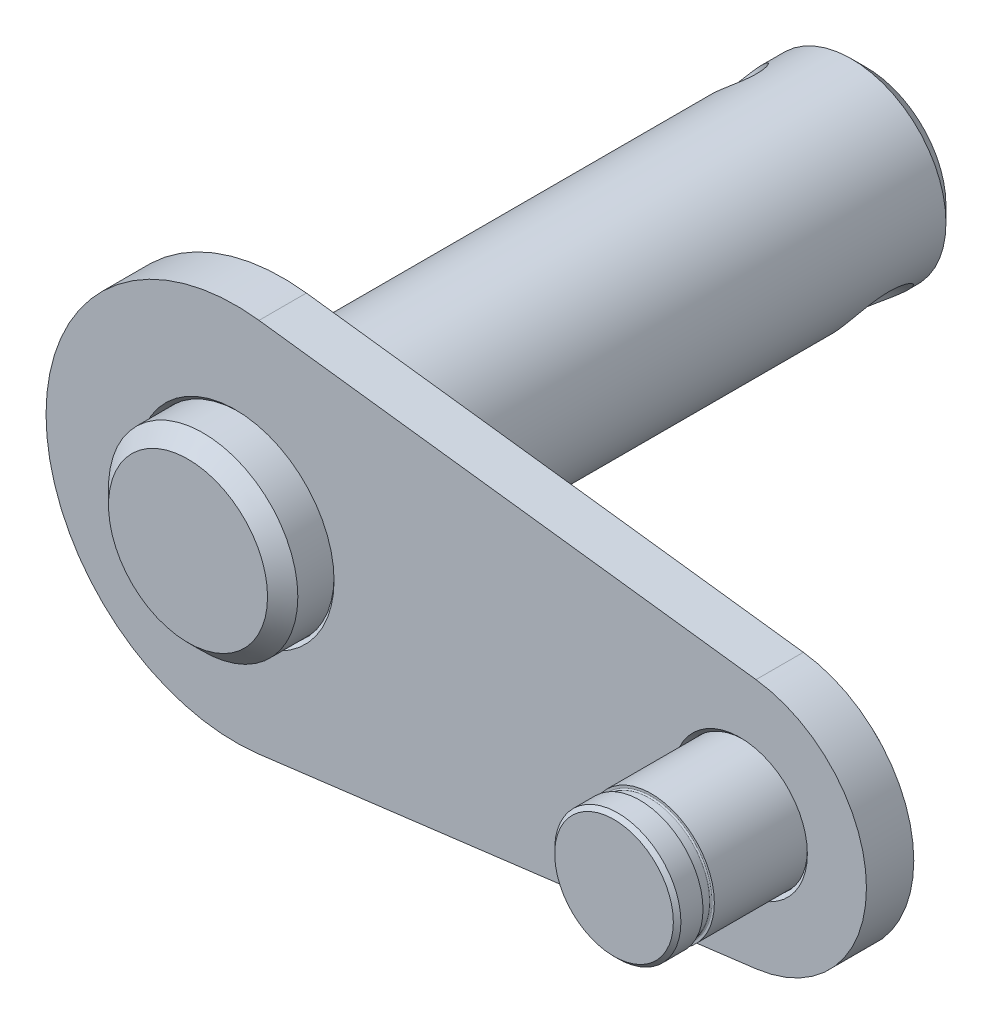
ISO-10303-21;
HEADER;
FILE_DESCRIPTION(('STEP AP214'),'2;1');
FILE_NAME('part.step','',(''),(''),'','','');
FILE_SCHEMA(('AUTOMOTIVE_DESIGN { 1 0 10303 214 1 1 1 1 }'));
ENDSEC;
DATA;
#1=APPLICATION_CONTEXT('core data for automotive mechanical design processes');
#2=APPLICATION_PROTOCOL_DEFINITION('international standard','automotive_design',2000,#1);
#3=PRODUCT_CONTEXT('',#1,'mechanical');
#4=PRODUCT('Part','Part','',(#3));
#5=PRODUCT_RELATED_PRODUCT_CATEGORY('part','',(#4));
#6=PRODUCT_DEFINITION_FORMATION('','',#4);
#7=PRODUCT_DEFINITION_CONTEXT('part definition',#1,'design');
#8=PRODUCT_DEFINITION('design','',#6,#7);
#9=PRODUCT_DEFINITION_SHAPE('','',#8);
#10=(LENGTH_UNIT() NAMED_UNIT(*) SI_UNIT(.MILLI.,.METRE.));
#11=(NAMED_UNIT(*) PLANE_ANGLE_UNIT() SI_UNIT($,.RADIAN.));
#12=(NAMED_UNIT(*) SI_UNIT($,.STERADIAN.) SOLID_ANGLE_UNIT());
#13=UNCERTAINTY_MEASURE_WITH_UNIT(LENGTH_MEASURE(1.E-05),#10,'distance_accuracy_value','');
#14=(GEOMETRIC_REPRESENTATION_CONTEXT(3) GLOBAL_UNCERTAINTY_ASSIGNED_CONTEXT((#13)) GLOBAL_UNIT_ASSIGNED_CONTEXT((#10,
#11,#12)) REPRESENTATION_CONTEXT('',''));
#15=CARTESIAN_POINT('',(0.,0.,0.));
#16=DIRECTION('',(0.,0.,1.));
#17=DIRECTION('',(1.,0.,0.));
#18=AXIS2_PLACEMENT_3D('',#15,#16,#17);
#19=CARTESIAN_POINT('',(50.8000000000001,0.,-29.8667622421394));
#20=DIRECTION('',(0.,0.,1.00000000000001));
#21=DIRECTION('',(1.,0.,0.));
#22=AXIS2_PLACEMENT_3D('',#19,#20,#21);
#23=CYLINDRICAL_SURFACE('',#22,6.35);
#24=CARTESIAN_POINT('',(50.8000000000001,0.,14.700249999999));
#25=DIRECTION('',(0.,0.,1.00000000000001));
#26=DIRECTION('',(1.,0.,0.));
#27=AXIS2_PLACEMENT_3D('',#24,#25,#26);
#28=CIRCLE('',#27,6.35);
#29=CARTESIAN_POINT('',(57.1500000000001,0.,14.700249999999));
#30=VERTEX_POINT('',#29);
#31=EDGE_CURVE('E52',#30,#30,#28,.F.);
#32=ORIENTED_EDGE('',*,*,#31,.T.);
#33=EDGE_LOOP('',(#32));
#34=FACE_BOUND('',#33,.T.);
#35=CARTESIAN_POINT('',(50.8000000000001,-3.33066907387547E-13,12.477749999999));
#36=DIRECTION('',(0.,0.,1.00000000000001));
#37=DIRECTION('',(0.,-1.,0.));
#38=AXIS2_PLACEMENT_3D('',#35,#36,#37);
#39=CIRCLE('',#38,6.35000000000001);
#40=CARTESIAN_POINT('',(50.8000000000001,-6.35000000000035,12.477749999999));
#41=VERTEX_POINT('',#40);
#42=EDGE_CURVE('E65',#41,#41,#39,.T.);
#43=ORIENTED_EDGE('',*,*,#42,.T.);
#44=EDGE_LOOP('',(#43));
#45=FACE_BOUND('',#44,.T.);
#46=ADVANCED_FACE('F45',(#34,#45),#23,.T.);
#47=CARTESIAN_POINT('',(0.,0.,15.08125));
#48=DIRECTION('',(0.,0.,1.00000000000001));
#49=DIRECTION('',(1.,0.,0.));
#50=AXIS2_PLACEMENT_3D('',#47,#48,#49);
#51=PLANE('',#50);
#52=CARTESIAN_POINT('',(50.8000000000001,0.,15.0812499999989));
#53=DIRECTION('',(0.,0.,1.00000000000001));
#54=DIRECTION('',(1.,0.,0.));
#55=AXIS2_PLACEMENT_3D('',#52,#53,#54);
#56=CIRCLE('',#55,5.969);
#57=CARTESIAN_POINT('',(56.7690000000001,0.,15.0812499999989));
#58=VERTEX_POINT('',#57);
#59=EDGE_CURVE('E60',#58,#58,#56,.T.);
#60=ORIENTED_EDGE('',*,*,#59,.T.);
#61=EDGE_LOOP('',(#60));
#62=FACE_BOUND('',#61,.T.);
#63=ADVANCED_FACE('F98',(#62),#51,.T.);
#64=CARTESIAN_POINT('',(50.8000000000001,0.,15.0812499999989));
#65=DIRECTION('',(0.,0.,-1.00000000000001));
#66=DIRECTION('',(-1.,0.,0.));
#67=AXIS2_PLACEMENT_3D('',#64,#65,#66);
#68=CONICAL_SURFACE('',#67,5.969,0.785398163397458);
#69=ORIENTED_EDGE('',*,*,#31,.F.);
#70=EDGE_LOOP('',(#69));
#71=FACE_BOUND('',#70,.T.);
#72=ORIENTED_EDGE('',*,*,#59,.F.);
#73=EDGE_LOOP('',(#72));
#74=FACE_BOUND('',#73,.T.);
#75=ADVANCED_FACE('F102',(#71,#74),#68,.T.);
#76=CARTESIAN_POINT('',(57.147235318125,-0.187360124756952,12.4777499999994));
#77=DIRECTION('',(0.,0.,-1.00000000000001));
#78=DIRECTION('',(0.,1.,0.));
#79=AXIS2_PLACEMENT_3D('',#76,#77,#78);
#80=PLANE('',#79);
#81=CARTESIAN_POINT('',(50.8000000000001,-3.33066907387547E-13,12.477749999999));
#82=DIRECTION('',(0.,0.,1.00000000000001));
#83=DIRECTION('',(0.,-1.,0.));
#84=AXIS2_PLACEMENT_3D('',#81,#82,#83);
#85=CIRCLE('',#84,6.12140000000001);
#86=CARTESIAN_POINT('',(50.8000000000001,-6.12140000000034,12.477749999999));
#87=VERTEX_POINT('',#86);
#88=EDGE_CURVE('E68',#87,#87,#85,.T.);
#89=ORIENTED_EDGE('',*,*,#88,.T.);
#90=EDGE_LOOP('',(#89));
#91=FACE_BOUND('',#90,.T.);
#92=ORIENTED_EDGE('',*,*,#42,.F.);
#93=EDGE_LOOP('',(#92));
#94=FACE_BOUND('',#93,.T.);
#95=ADVANCED_FACE('F108',(#91,#94),#80,.T.);
#96=CARTESIAN_POINT('',(50.8000000000001,-3.33066907387547E-13,12.350749999999));
#97=DIRECTION('',(0.,0.,1.00000000000001));
#98=DIRECTION('',(0.,-1.,0.));
#99=AXIS2_PLACEMENT_3D('',#96,#97,#98);
#100=TOROIDAL_SURFACE('',#99,6.12140000000001,0.127000000000005);
#101=CARTESIAN_POINT('',(50.8000000000001,-3.33066907387547E-13,12.350749999999));
#102=DIRECTION('',(0.,0.,1.00000000000001));
#103=DIRECTION('',(0.,-1.,0.));
#104=AXIS2_PLACEMENT_3D('',#101,#102,#103);
#105=CIRCLE('',#104,5.99440000000001);
#106=CARTESIAN_POINT('',(50.8000000000001,-5.99440000000034,12.350749999999));
#107=VERTEX_POINT('',#106);
#108=EDGE_CURVE('E71',#107,#107,#105,.T.);
#109=ORIENTED_EDGE('',*,*,#108,.T.);
#110=EDGE_LOOP('',(#109));
#111=FACE_BOUND('',#110,.T.);
#112=ORIENTED_EDGE('',*,*,#88,.F.);
#113=EDGE_LOOP('',(#112));
#114=FACE_BOUND('',#113,.T.);
#115=ADVANCED_FACE('F110',(#111,#114),#100,.F.);
#116=CARTESIAN_POINT('',(50.7999999999999,4.44089209850063E-13,-19.2562427449352));
#117=DIRECTION('',(0.,0.,1.00000000000001));
#118=DIRECTION('',(0.,-1.,0.));
#119=AXIS2_PLACEMENT_3D('',#116,#117,#118);
#120=CYLINDRICAL_SURFACE('',#119,5.99440000000001);
#121=CARTESIAN_POINT('',(50.8000000000001,-3.33066907387547E-13,11.4617499999989));
#122=DIRECTION('',(0.,0.,1.00000000000001));
#123=DIRECTION('',(0.,-1.,0.));
#124=AXIS2_PLACEMENT_3D('',#121,#122,#123);
#125=CIRCLE('',#124,5.99440000000001);
#126=CARTESIAN_POINT('',(50.8000000000001,-5.99440000000034,11.4617499999989));
#127=VERTEX_POINT('',#126);
#128=EDGE_CURVE('E74',#127,#127,#125,.T.);
#129=ORIENTED_EDGE('',*,*,#128,.T.);
#130=EDGE_LOOP('',(#129));
#131=FACE_BOUND('',#130,.T.);
#132=ORIENTED_EDGE('',*,*,#108,.F.);
#133=EDGE_LOOP('',(#132));
#134=FACE_BOUND('',#133,.T.);
#135=ADVANCED_FACE('F117',(#131,#134),#120,.T.);
#136=CARTESIAN_POINT('',(50.8000000000001,-3.33066907387547E-13,11.4617499999989));
#137=DIRECTION('',(0.,0.,1.00000000000001));
#138=DIRECTION('',(0.,-1.,0.));
#139=AXIS2_PLACEMENT_3D('',#136,#137,#138);
#140=TOROIDAL_SURFACE('',#139,6.12140000000001,0.127000000000003);
#141=CARTESIAN_POINT('',(50.8000000000001,-1.11022302462516E-13,11.3347499999989));
#142=DIRECTION('',(0.,0.,1.00000000000001));
#143=DIRECTION('',(0.,-1.,0.));
#144=AXIS2_PLACEMENT_3D('',#141,#142,#143);
#145=CIRCLE('',#144,6.12140000000001);
#146=CARTESIAN_POINT('',(50.8000000000001,-6.12140000000012,11.3347499999989));
#147=VERTEX_POINT('',#146);
#148=EDGE_CURVE('E77',#147,#147,#145,.T.);
#149=ORIENTED_EDGE('',*,*,#148,.T.);
#150=EDGE_LOOP('',(#149));
#151=FACE_BOUND('',#150,.T.);
#152=ORIENTED_EDGE('',*,*,#128,.F.);
#153=EDGE_LOOP('',(#152));
#154=FACE_BOUND('',#153,.T.);
#155=ADVANCED_FACE('F126',(#151,#154),#140,.F.);
#156=CARTESIAN_POINT('',(56.9187348466724,-0.180615160265796,11.3347499999994));
#157=DIRECTION('',(0.,0.,1.00000000000001));
#158=DIRECTION('',(0.,-1.,0.));
#159=AXIS2_PLACEMENT_3D('',#156,#157,#158);
#160=PLANE('',#159);
#161=CARTESIAN_POINT('',(50.8000000000001,-1.11022302462516E-13,11.3347499999989));
#162=DIRECTION('',(0.,0.,1.00000000000001));
#163=DIRECTION('',(0.,-1.,0.));
#164=AXIS2_PLACEMENT_3D('',#161,#162,#163);
#165=CIRCLE('',#164,6.35000000000001);
#166=CARTESIAN_POINT('',(50.8000000000001,-6.35000000000012,11.3347499999989));
#167=VERTEX_POINT('',#166);
#168=EDGE_CURVE('E80',#167,#167,#165,.T.);
#169=ORIENTED_EDGE('',*,*,#168,.T.);
#170=EDGE_LOOP('',(#169));
#171=FACE_BOUND('',#170,.T.);
#172=ORIENTED_EDGE('',*,*,#148,.F.);
#173=EDGE_LOOP('',(#172));
#174=FACE_BOUND('',#173,.T.);
#175=ADVANCED_FACE('F84',(#171,#174),#160,.T.);
#176=CARTESIAN_POINT('',(0.,0.,-7.14375));
#177=DIRECTION('',(0.,0.,1.00000000000001));
#178=DIRECTION('',(1.,0.,0.));
#179=AXIS2_PLACEMENT_3D('',#176,#177,#178);
#180=PLANE('',#179);
#181=CARTESIAN_POINT('',(50.8000000000003,-1.11022302462516E-13,-7.14375000000111));
#182=DIRECTION('',(0.,0.,1.00000000000001));
#183=DIRECTION('',(1.,0.,0.));
#184=AXIS2_PLACEMENT_3D('',#181,#182,#183);
#185=CIRCLE('',#184,5.969);
#186=CARTESIAN_POINT('',(56.7690000000003,-1.11022302462516E-13,-7.14375000000111));
#187=VERTEX_POINT('',#186);
#188=EDGE_CURVE('E11',#187,#187,#185,.F.);
#189=ORIENTED_EDGE('',*,*,#188,.T.);
#190=EDGE_LOOP('',(#189));
#191=FACE_BOUND('',#190,.T.);
#192=ADVANCED_FACE('F94',(#191),#180,.F.);
#193=CARTESIAN_POINT('',(50.8000000000003,-1.11022302462516E-13,-7.14375000000111));
#194=DIRECTION('',(0.,0.,1.00000000000001));
#195=DIRECTION('',(1.,0.,0.));
#196=AXIS2_PLACEMENT_3D('',#193,#194,#195);
#197=CONICAL_SURFACE('',#196,5.969,0.785398163397454);
#198=CARTESIAN_POINT('',(50.8000000000003,-1.11022302462516E-13,-6.76275000000104));
#199=DIRECTION('',(0.,0.,1.00000000000001));
#200=DIRECTION('',(1.,0.,0.));
#201=AXIS2_PLACEMENT_3D('',#198,#199,#200);
#202=CIRCLE('',#201,6.35);
#203=CARTESIAN_POINT('',(57.1500000000003,-1.11022302462516E-13,-6.76275000000104));
#204=VERTEX_POINT('',#203);
#205=EDGE_CURVE('E56',#204,#204,#202,.T.);
#206=ORIENTED_EDGE('',*,*,#205,.F.);
#207=EDGE_LOOP('',(#206));
#208=FACE_BOUND('',#207,.T.);
#209=ORIENTED_EDGE('',*,*,#188,.F.);
#210=EDGE_LOOP('',(#209));
#211=FACE_BOUND('',#210,.T.);
#212=ADVANCED_FACE('F47',(#208,#211),#197,.T.);
#213=ORIENTED_EDGE('',*,*,#205,.T.);
#214=EDGE_LOOP('',(#213));
#215=FACE_BOUND('',#214,.T.);
#216=ORIENTED_EDGE('',*,*,#168,.F.);
#217=EDGE_LOOP('',(#216));
#218=FACE_BOUND('',#217,.T.);
#219=ADVANCED_FACE('F87',(#215,#218),#23,.T.);
#220=CLOSED_SHELL('',(#46,#63,#75,#95,#115,#135,#155,#175,#192,#212,#219));
#221=MANIFOLD_SOLID_BREP('B2',#220);
#222=CARTESIAN_POINT('',(0.,1.38777878078145E-13,-61.11875));
#223=DIRECTION('',(0.,0.,1.00000000000001));
#224=DIRECTION('',(1.,0.,0.));
#225=AXIS2_PLACEMENT_3D('',#222,#223,#224);
#226=CYLINDRICAL_SURFACE('',#225,9.525);
#227=CARTESIAN_POINT('',(-4.68377995589911,8.29384291656846,-54.76875));
#228=CARTESIAN_POINT('',(-4.68378402003064,8.29384226204901,-54.909345049931));
#229=CARTESIAN_POINT('',(-4.69433092833028,8.28791137250007,-55.0499752980467));
#230=CARTESIAN_POINT('',(-4.73596023682551,8.2641914703885,-55.327172480009));
#231=CARTESIAN_POINT('',(-4.76705280516134,8.2463965862421,-55.4637373668992));
#232=CARTESIAN_POINT('',(-4.84810524928736,8.19900507017028,-55.7287536794259));
#233=CARTESIAN_POINT('',(-4.89803841293963,8.16942514373694,-55.8572162928709));
#234=CARTESIAN_POINT('',(-5.01442231957214,8.09850718420594,-56.1029061624815));
#235=CARTESIAN_POINT('',(-5.08087439275829,8.05716820415704,-56.2201325127789));
#236=CARTESIAN_POINT('',(-5.22916284416905,7.96174671624622,-56.4429837449493));
#237=CARTESIAN_POINT('',(-5.31131575571435,7.90739486819168,-56.5482827413133));
#238=CARTESIAN_POINT('',(-5.48666869963026,7.7867451752006,-56.7414085370429));
#239=CARTESIAN_POINT('',(-5.57986988539915,7.72044608264016,-56.8292335096181));
#240=CARTESIAN_POINT('',(-5.77540291076642,7.57531420515426,-56.9862792821029));
#241=CARTESIAN_POINT('',(-5.87785816720826,7.49629584197274,-57.0551757861168));
#242=CARTESIAN_POINT('',(-6.08674529361907,7.32769700879379,-57.1702934247073));
#243=CARTESIAN_POINT('',(-6.19317648273363,7.23811834157207,-57.2165184226602));
#244=CARTESIAN_POINT('',(-6.40371171719545,7.05247012550787,-57.2839252836124));
#245=CARTESIAN_POINT('',(-6.50781265926609,6.95659859310025,-57.3056615737036));
#246=CARTESIAN_POINT('',(-6.71272108730565,6.75908540225948,-57.3252186671598));
#247=CARTESIAN_POINT('',(-6.81352912693017,6.65744472177772,-57.3230435118761));
#248=CARTESIAN_POINT('',(-7.00636701285387,6.45411440924462,-57.2952291968276));
#249=CARTESIAN_POINT('',(-7.09855504700041,6.35249196551038,-57.27018909927));
#250=CARTESIAN_POINT('',(-7.27478023911175,6.14989711644213,-57.1983239113648));
#251=CARTESIAN_POINT('',(-7.35881692964114,6.04892474869609,-57.1514975725855));
#252=CARTESIAN_POINT('',(-7.51797685241814,5.84996211928975,-57.0369320495759));
#253=CARTESIAN_POINT('',(-7.59300246018938,5.75201181663803,-56.9689882569542));
#254=CARTESIAN_POINT('',(-7.73217673918558,5.56352540074797,-56.8142737184009));
#255=CARTESIAN_POINT('',(-7.79632326749839,5.47299075002301,-56.727499270947));
#256=CARTESIAN_POINT('',(-7.91501900209192,5.29994920592269,-56.5344092525627));
#257=CARTESIAN_POINT('',(-7.96920905479226,5.21777816856796,-56.4275713056199));
#258=CARTESIAN_POINT('',(-8.06519820818001,5.06814832018989,-56.1990375552524));
#259=CARTESIAN_POINT('',(-8.10699653766444,5.00069042491284,-56.0773408277517));
#260=CARTESIAN_POINT('',(-8.17832523636502,4.88317497186654,-55.821469829642));
#261=CARTESIAN_POINT('',(-8.2077768835281,4.83322939258566,-55.6872219732239));
#262=CARTESIAN_POINT('',(-8.25397579862006,4.75390775499108,-55.4107073882125));
#263=CARTESIAN_POINT('',(-8.27072625352637,4.72452653681965,-55.2684426808354));
#264=CARTESIAN_POINT('',(-8.29119250904776,4.68851479415504,-54.9845319984684));
#265=CARTESIAN_POINT('',(-8.29528626384511,4.68122472010844,-54.8429968136096));
#266=CARTESIAN_POINT('',(-8.29150311570964,4.68792241707254,-54.5606025087338));
#267=CARTESIAN_POINT('',(-8.28362750126998,4.7019078977867,-54.419743317584));
#268=CARTESIAN_POINT('',(-8.25619310191319,4.7499086163801,-54.1455347966091));
#269=CARTESIAN_POINT('',(-8.23686462743189,4.78352882445834,-54.0120926715557));
#270=CARTESIAN_POINT('',(-8.186742187749,4.86880971086198,-53.7533824689106));
#271=CARTESIAN_POINT('',(-8.15594671418695,4.92047276247396,-53.6281154692175));
#272=CARTESIAN_POINT('',(-8.08212287989226,5.04083224385145,-53.3862452817534));
#273=CARTESIAN_POINT('',(-8.03883843729665,5.10988093111487,-53.2698957601679));
#274=CARTESIAN_POINT('',(-7.9404432121386,5.26147664468053,-53.0519078992551));
#275=CARTESIAN_POINT('',(-7.88533018299071,5.3440262344789,-52.9502723606812));
#276=CARTESIAN_POINT('',(-7.76177032815771,5.52201048556644,-52.7615459798668));
#277=CARTESIAN_POINT('',(-7.69298086743729,5.6177512288572,-52.6749670678564));
#278=CARTESIAN_POINT('',(-7.54383830520723,5.81648864559542,-52.5225669759385));
#279=CARTESIAN_POINT('',(-7.46348581969952,5.91948493236613,-52.4567446908502));
#280=CARTESIAN_POINT('',(-7.29311621629906,6.12813714372314,-52.3483326476022));
#281=CARTESIAN_POINT('',(-7.20317768352102,6.23376671459871,-52.305569118282));
#282=CARTESIAN_POINT('',(-7.01509375759544,6.44468970722874,-52.243986012542));
#283=CARTESIAN_POINT('',(-6.91695020803662,6.54998319900643,-52.225161072678));
#284=CARTESIAN_POINT('',(-6.71827558039733,6.75351773326941,-52.212328320711));
#285=CARTESIAN_POINT('',(-6.61791259794982,6.85187620009147,-52.2175699209955));
#286=CARTESIAN_POINT('',(-6.41499451389173,7.04221722894084,-52.2509767133033));
#287=CARTESIAN_POINT('',(-6.31243949621002,7.13420003451002,-52.2791410291848));
#288=CARTESIAN_POINT('',(-6.10916643436846,7.30900621398491,-52.3571676754819));
#289=CARTESIAN_POINT('',(-6.00844054980721,7.3918893303844,-52.4068763646225));
#290=CARTESIAN_POINT('',(-5.81140822644391,7.54777850112063,-52.5264436113917));
#291=CARTESIAN_POINT('',(-5.71510241445645,7.62078315742612,-52.5963050167248));
#292=CARTESIAN_POINT('',(-5.52770123827399,7.75783434405962,-52.7563837773804));
#293=CARTESIAN_POINT('',(-5.43681550039551,7.8215873499186,-52.847097799747));
#294=CARTESIAN_POINT('',(-5.26654939841249,7.9372349365128,-53.045366608704));
#295=CARTESIAN_POINT('',(-5.18717207822581,7.98912638201083,-53.1529258351732));
#296=CARTESIAN_POINT('',(-5.04154085886012,8.08183924177347,-53.3847140319971));
#297=CARTESIAN_POINT('',(-4.97561866276882,8.12238832880745,-53.5092609482052));
#298=CARTESIAN_POINT('',(-4.86229559734996,8.19073347450457,-53.7697101438806));
#299=CARTESIAN_POINT('',(-4.81488273068386,8.2185377960857,-53.9056049982817));
#300=CARTESIAN_POINT('',(-4.74696920243177,8.2579162729876,-54.162270855136));
#301=CARTESIAN_POINT('',(-4.72335874663265,8.27138646798356,-54.2819396498321));
#302=CARTESIAN_POINT('',(-4.69176326582578,8.28934955097933,-54.5239802821922));
#303=CARTESIAN_POINT('',(-4.68377641777758,8.29384348637515,-54.6463518028032));
#304=CARTESIAN_POINT('',(-4.68377995589911,8.29384291656846,-54.76875));
#305=B_SPLINE_CURVE_WITH_KNOTS('',3,(#227,#228,#229,#230,#231,#232,#233,#234,#235,#236,#237,
#238,#239,#240,#241,#242,#243,#244,#245,#246,#247,#248,#249,#250,#251,#252,#253,#254,#255,#256,
#257,#258,#259,#260,#261,#262,#263,#264,#265,#266,#267,#268,#269,#270,#271,#272,#273,#274,#275,
#276,#277,#278,#279,#280,#281,#282,#283,#284,#285,#286,#287,#288,#289,#290,#291,#292,#293,#294,
#295,#296,#297,#298,#299,#300,#301,#302,#303,#304),.UNSPECIFIED.,.T.,.F.,(4,2,2,2,2,2,2,2,2,2,2,
2,2,2,2,2,2,2,2,2,2,2,2,2,2,2,2,2,2,2,2,2,2,2,2,2,2,2,4),(0.,0.421335020659554,
0.842878718260196,1.26382698468508,1.68480915948396,2.11540048423196,2.54603680074909,
2.98364660501428,3.4211818117097,3.84859855570409,4.27594306171031,4.69240268722913,
5.10888618035059,5.52953789787911,5.95027237749886,6.38404937132399,6.81785335573916,
7.25438267369832,7.69080242163876,8.11405736715002,8.53726675282739,8.95224141892331,
9.3672706897694,9.79150173254864,10.2158134202998,10.6525267460237,11.0892168151401,
11.5225682797685,11.9558226348246,12.3756580595251,12.7954774382165,13.2123509529828,
13.6292834034534,14.0574224048775,14.4856744411055,14.9234656318918,15.3609725830661,
15.7278181124889,16.0946208339925),.UNSPECIFIED.);
#306=CARTESIAN_POINT('',(-4.68377995589911,8.29384291656846,-54.76875));
#307=VERTEX_POINT('',#306);
#308=EDGE_CURVE('E217',#307,#307,#305,.T.);
#309=ORIENTED_EDGE('',*,*,#308,.F.);
#310=EDGE_LOOP('',(#309));
#311=FACE_BOUND('',#310,.T.);
#312=CARTESIAN_POINT('',(5.1679403436812,-8.0011266175832,-57.7561360173459));
#313=CARTESIAN_POINT('',(5.27892748475485,-7.92943918943597,-57.87621325556));
#314=CARTESIAN_POINT('',(5.39612800949165,-7.85046296996892,-57.9865307846685));
#315=CARTESIAN_POINT('',(5.63973099358344,-7.67732875959539,-58.1829254593078));
#316=CARTESIAN_POINT('',(5.76614510142951,-7.5831513610197,-58.2689712254865));
#317=CARTESIAN_POINT('',(6.02524552742601,-7.37898780911214,-58.4125730300566));
#318=CARTESIAN_POINT('',(6.15798437414737,-7.26884371305203,-58.4698153191243));
#319=CARTESIAN_POINT('',(6.42270110597528,-7.03601047447201,-58.5499560664528));
#320=CARTESIAN_POINT('',(6.55467982224899,-6.91333998998166,-58.572904830151));
#321=CARTESIAN_POINT('',(6.79256340998292,-6.67909549657801,-58.581899197801));
#322=CARTESIAN_POINT('',(6.89940100519402,-6.56863383988351,-58.5729834051293));
#323=CARTESIAN_POINT('',(7.10522013692382,-6.34543161873812,-58.5297018599251));
#324=CARTESIAN_POINT('',(7.20420178394463,-6.23269108636999,-58.4953364654379));
#325=CARTESIAN_POINT('',(7.38975623064452,-6.01144631899688,-58.4043928934079));
#326=CARTESIAN_POINT('',(7.47658173058252,-5.90290750001222,-58.3484055660947));
#327=CARTESIAN_POINT('',(7.63985394652814,-5.6900158774715,-58.2168869641826));
#328=CARTESIAN_POINT('',(7.71629776101561,-5.58566424988818,-58.1413502429006));
#329=CARTESIAN_POINT('',(7.86689777340144,-5.37183199530569,-57.9638602150415));
#330=CARTESIAN_POINT('',(7.93977097585572,-5.26315009070044,-57.8598639232174));
#331=CARTESIAN_POINT('',(8.07299341674964,-5.05643694272897,-57.634721227739));
#332=CARTESIAN_POINT('',(8.13333513272567,-4.95841211336996,-57.5135645959579));
#333=CARTESIAN_POINT('',(8.25182635488056,-4.75906348472478,-57.2350237455847));
#334=CARTESIAN_POINT('',(8.30777988731928,-4.66011702497368,-57.0750009279364));
#335=CARTESIAN_POINT('',(8.40512088275364,-4.48217195910179,-56.7401187792121));
#336=CARTESIAN_POINT('',(8.44649973132796,-4.40318515797836,-56.5652507493332));
#337=CARTESIAN_POINT('',(8.52073282958397,-4.25797196996028,-56.1797741735277));
#338=CARTESIAN_POINT('',(8.55163395307155,-4.19499118878532,-55.9675565839676));
#339=CARTESIAN_POINT('',(8.59753391774683,-4.10010021316438,-55.5346298470198));
#340=CARTESIAN_POINT('',(8.61252988419155,-4.06819563560418,-55.3139191720358));
#341=CARTESIAN_POINT('',(8.62762080718411,-4.03610620466038,-54.8594700948856));
#342=CARTESIAN_POINT('',(8.62700119374747,-4.0374424174261,-54.6255982807695));
#343=CARTESIAN_POINT('',(8.60905959200159,-4.07555385926151,-54.1614023934012));
#344=CARTESIAN_POINT('',(8.59173595335097,-4.11233259001713,-53.9310786729817));
#345=CARTESIAN_POINT('',(8.53950177790038,-4.21972560258075,-53.4800663876672));
#346=CARTESIAN_POINT('',(8.50455853645917,-4.29040279309365,-53.2593965726929));
#347=CARTESIAN_POINT('',(8.415392071344,-4.46275500170708,-52.8344229602536));
#348=CARTESIAN_POINT('',(8.36115587009048,-4.56445087822065,-52.6301302926426));
#349=CARTESIAN_POINT('',(8.2320542924299,-4.79332023249469,-52.247733488646));
#350=CARTESIAN_POINT('',(8.15749881817307,-4.92010370246878,-52.0692931408699));
#351=CARTESIAN_POINT('',(7.98500303541009,-5.19533670741876,-51.7431350046623));
#352=CARTESIAN_POINT('',(7.88711238934667,-5.34373997330458,-51.5953532005895));
#353=CARTESIAN_POINT('',(7.69853191986571,-5.6104033374422,-51.3768946296359));
#354=CARTESIAN_POINT('',(7.61399344065689,-5.72491636477795,-51.2962870662036));
#355=CARTESIAN_POINT('',(7.43264737625678,-5.95845216718702,-51.1588682910949));
#356=CARTESIAN_POINT('',(7.33585058018453,-6.07747091275746,-51.1020363404218));
#357=CARTESIAN_POINT('',(7.13081628161338,-6.31680398507322,-51.01522467366));
#358=CARTESIAN_POINT('',(7.02251874260689,-6.43712183714263,-50.985394471881));
#359=CARTESIAN_POINT('',(6.79788439343799,-6.67390242471569,-50.9552526705365));
#360=CARTESIAN_POINT('',(6.68155016668543,-6.79036638142118,-50.9549316289699));
#361=CARTESIAN_POINT('',(6.45577403177601,-7.00504664413942,-50.9824656500353));
#362=CARTESIAN_POINT('',(6.34666832255637,-7.10395904086464,-51.0077592744602));
#363=CARTESIAN_POINT('',(6.12855858509707,-7.29295776825592,-51.0811980256172));
#364=CARTESIAN_POINT('',(6.01955457013232,-7.38304307294519,-51.1293458049056));
#365=CARTESIAN_POINT('',(5.80165849078788,-7.55554584657584,-51.2477332977857));
#366=CARTESIAN_POINT('',(5.69285942060623,-7.63766905493669,-51.3185673779949));
#367=CARTESIAN_POINT('',(5.48137273085449,-7.79084467297598,-51.4787961561512));
#368=CARTESIAN_POINT('',(5.37868757903815,-7.86189263083649,-51.5681982842234));
#369=CARTESIAN_POINT('',(5.16735921865211,-8.00264934334914,-51.7766581025742));
#370=CARTESIAN_POINT('',(5.05999260522326,-8.07068713279403,-51.8981332190324));
#371=CARTESIAN_POINT('',(4.85854796886503,-8.19353903724379,-52.1576369426808));
#372=CARTESIAN_POINT('',(4.76447850576369,-8.24834465017176,-52.2956761079702));
#373=CARTESIAN_POINT('',(4.57673739694012,-8.35419991206012,-52.6098955728401));
#374=CARTESIAN_POINT('',(4.48591914097617,-8.40298077583859,-52.7885518218773));
#375=CARTESIAN_POINT('',(4.32792798820881,-8.48543533700333,-53.1593098215089));
#376=CARTESIAN_POINT('',(4.26076691230438,-8.51910148424538,-53.3514182365041));
#377=CARTESIAN_POINT('',(4.14633265305342,-8.57543661906679,-53.7661398508754));
#378=CARTESIAN_POINT('',(4.10202291058216,-8.59650813961681,-53.9897963820781));
#379=CARTESIAN_POINT('',(4.04710122850992,-8.622501000436,-54.4420885944704));
#380=CARTESIAN_POINT('',(4.036487411685,-8.62742324039356,-54.670723997569));
#381=CARTESIAN_POINT('',(4.04957824091619,-8.62128810006677,-55.1319846584168));
#382=CARTESIAN_POINT('',(4.07406318418573,-8.60986740205537,-55.3645834404484));
#383=CARTESIAN_POINT('',(4.15766721164608,-8.56980414953618,-55.8221991023309));
#384=CARTESIAN_POINT('',(4.21682190762065,-8.54114388623933,-56.0472079343108));
#385=CARTESIAN_POINT('',(4.36729375787787,-8.46519193985815,-56.4832425091552));
#386=CARTESIAN_POINT('',(4.45866009128411,-8.41787175456928,-56.6942462811459));
#387=CARTESIAN_POINT('',(4.66984705354109,-8.30256059334645,-57.0948297378053));
#388=CARTESIAN_POINT('',(4.78957498073057,-8.23463676297119,-57.2844763111148));
#389=CARTESIAN_POINT('',(4.96022978257893,-8.13165542548493,-57.5117272633461));
#390=CARTESIAN_POINT('',(5.0003887741447,-8.10703906111786,-57.5625332384372));
#391=CARTESIAN_POINT('',(5.08269924498395,-8.05569078277425,-57.6614292435786));
#392=CARTESIAN_POINT('',(5.12485154009362,-8.02895799950056,-57.7095181435751));
#393=CARTESIAN_POINT('',(5.1679403436812,-8.0011266175832,-57.7561360173459));
#394=B_SPLINE_CURVE_WITH_KNOTS('',3,(#312,#313,#314,#315,#316,#317,#318,#319,#320,#321,#322,
#323,#324,#325,#326,#327,#328,#329,#330,#331,#332,#333,#334,#335,#336,#337,#338,#339,#340,#341,
#342,#343,#344,#345,#346,#347,#348,#349,#350,#351,#352,#353,#354,#355,#356,#357,#358,#359,#360,
#361,#362,#363,#364,#365,#366,#367,#368,#369,#370,#371,#372,#373,#374,#375,#376,#377,#378,#379,
#380,#381,#382,#383,#384,#385,#386,#387,#388,#389,#390,#391,#392,#393),.UNSPECIFIED.,.T.,.F.,(4,
2,2,2,2,2,2,2,2,2,2,2,2,2,2,2,2,2,2,2,2,2,2,2,2,2,2,2,2,2,2,2,2,2,2,2,2,2,2,2,4),(0.,
0.535369858578368,1.07142872183517,1.61320676242703,2.1541892817919,2.61367324915294,
3.07315075224681,3.52087174032372,3.96871760309116,4.46826711904718,4.96811564580281,
5.5546706873966,6.14157183506603,6.80913281468827,7.47681443061543,8.17510243162234,
8.87345942987114,9.57311748220688,10.2732470584304,10.9632444362749,11.6517862540605,
12.1405540363735,12.6288945827607,13.1199229189483,13.6107941410005,14.0569948376299,
14.5032473349958,14.9623069776781,15.4215506712147,15.9470279590773,16.4728419889058,
17.0891283568727,17.7057222322885,18.3894841175209,19.0732079092244,19.7723696889857,
20.4722508896089,21.1732052946608,21.8718994526059,22.0796615916347,22.2875095140142),.UNSPECIFIED.);
#395=CARTESIAN_POINT('',(5.1679403436812,-8.0011266175832,-57.7561360173459));
#396=VERTEX_POINT('',#395);
#397=EDGE_CURVE('E44',#396,#396,#394,.T.);
#398=ORIENTED_EDGE('',*,*,#397,.F.);
#399=EDGE_LOOP('',(#398));
#400=FACE_BOUND('',#399,.T.);
#401=CARTESIAN_POINT('',(0.,-1.66533453693773E-13,5.61975000000003));
#402=DIRECTION('',(0.,0.,1.00000000000001));
#403=DIRECTION('',(1.,0.,0.));
#404=AXIS2_PLACEMENT_3D('',#401,#402,#403);
#405=CIRCLE('',#404,9.525);
#406=CARTESIAN_POINT('',(9.52500000000001,-1.66533453693773E-13,5.61975000000003));
#407=VERTEX_POINT('',#406);
#408=EDGE_CURVE('E229',#407,#407,#405,.F.);
#409=ORIENTED_EDGE('',*,*,#408,.T.);
#410=EDGE_LOOP('',(#409));
#411=FACE_BOUND('',#410,.T.);
#412=CARTESIAN_POINT('',(-1.11022302462516E-13,1.94289029309402E-13,-59.59475));
#413=DIRECTION('',(0.,0.,1.00000000000001));
#414=DIRECTION('',(1.,0.,0.));
#415=AXIS2_PLACEMENT_3D('',#412,#413,#414);
#416=CIRCLE('',#415,9.525);
#417=CARTESIAN_POINT('',(9.52499999999989,1.94289029309402E-13,-59.59475));
#418=VERTEX_POINT('',#417);
#419=EDGE_CURVE('E262',#418,#418,#416,.T.);
#420=ORIENTED_EDGE('',*,*,#419,.T.);
#421=EDGE_LOOP('',(#420));
#422=FACE_BOUND('',#421,.T.);
#423=ADVANCED_FACE('F213',(#311,#400,#411,#422),#226,.T.);
#424=CARTESIAN_POINT('',(0.,1.38777878078145E-13,-61.11875));
#425=DIRECTION('',(0.,0.,1.00000000000001));
#426=DIRECTION('',(1.,0.,0.));
#427=AXIS2_PLACEMENT_3D('',#424,#425,#426);
#428=PLANE('',#427);
#429=CARTESIAN_POINT('',(0.,1.38777878078145E-13,-61.11875));
#430=DIRECTION('',(0.,0.,1.00000000000001));
#431=DIRECTION('',(1.,0.,0.));
#432=AXIS2_PLACEMENT_3D('',#429,#430,#431);
#433=CIRCLE('',#432,8.001);
#434=CARTESIAN_POINT('',(8.00099999999992,1.38777878078145E-13,-61.11875));
#435=VERTEX_POINT('',#434);
#436=EDGE_CURVE('E225',#435,#435,#433,.F.);
#437=ORIENTED_EDGE('',*,*,#436,.T.);
#438=EDGE_LOOP('',(#437));
#439=FACE_BOUND('',#438,.T.);
#440=ADVANCED_FACE('F248',(#439),#428,.F.);
#441=CARTESIAN_POINT('',(0.,0.,7.14375));
#442=DIRECTION('',(0.,0.,1.00000000000001));
#443=DIRECTION('',(1.,0.,0.));
#444=AXIS2_PLACEMENT_3D('',#441,#442,#443);
#445=PLANE('',#444);
#446=CARTESIAN_POINT('',(0.,0.,7.14375));
#447=DIRECTION('',(0.,0.,1.00000000000001));
#448=DIRECTION('',(1.,0.,0.));
#449=AXIS2_PLACEMENT_3D('',#446,#447,#448);
#450=CIRCLE('',#449,8.001);
#451=CARTESIAN_POINT('',(8.00100000000008,0.,7.14375));
#452=VERTEX_POINT('',#451);
#453=EDGE_CURVE('E264',#452,#452,#450,.T.);
#454=ORIENTED_EDGE('',*,*,#453,.T.);
#455=EDGE_LOOP('',(#454));
#456=FACE_BOUND('',#455,.T.);
#457=ADVANCED_FACE('F245',(#456),#445,.T.);
#458=CARTESIAN_POINT('',(0.,0.,7.14375));
#459=DIRECTION('',(0.,0.,-1.00000000000001));
#460=DIRECTION('',(-1.,0.,0.));
#461=AXIS2_PLACEMENT_3D('',#458,#459,#460);
#462=CONICAL_SURFACE('',#461,8.00099999999999,0.785398163397447);
#463=ORIENTED_EDGE('',*,*,#408,.F.);
#464=EDGE_LOOP('',(#463));
#465=FACE_BOUND('',#464,.T.);
#466=ORIENTED_EDGE('',*,*,#453,.F.);
#467=EDGE_LOOP('',(#466));
#468=FACE_BOUND('',#467,.T.);
#469=ADVANCED_FACE('F247',(#465,#468),#462,.T.);
#470=CARTESIAN_POINT('',(-1.11022302462516E-13,1.94289029309402E-13,-59.59475));
#471=DIRECTION('',(0.,0.,1.00000000000001));
#472=DIRECTION('',(1.,0.,0.));
#473=AXIS2_PLACEMENT_3D('',#470,#471,#472);
#474=CONICAL_SURFACE('',#473,9.525,0.785398163397451);
#475=ORIENTED_EDGE('',*,*,#436,.F.);
#476=EDGE_LOOP('',(#475));
#477=FACE_BOUND('',#476,.T.);
#478=ORIENTED_EDGE('',*,*,#419,.F.);
#479=EDGE_LOOP('',(#478));
#480=FACE_BOUND('',#479,.T.);
#481=ADVANCED_FACE('F215',(#477,#480),#474,.T.);
#482=CARTESIAN_POINT('',(6.73519209080176,-6.73519209080214,-54.76875));
#483=DIRECTION('',(0.707106781186549,-0.707106781186551,0.));
#484=DIRECTION('',(0.707106781186551,0.707106781186549,0.));
#485=AXIS2_PLACEMENT_3D('',#482,#483,#484);
#486=CYLINDRICAL_SURFACE('',#485,2.55269999999999);
#487=ORIENTED_EDGE('',*,*,#308,.T.);
#488=EDGE_LOOP('',(#487));
#489=FACE_BOUND('',#488,.T.);
#490=CARTESIAN_POINT('',(5.84614673481587,-5.84614673481634,-54.76875));
#491=DIRECTION('',(0.707106781186549,-0.707106781186551,0.));
#492=DIRECTION('',(0.707106781186551,0.707106781186549,0.));
#493=AXIS2_PLACEMENT_3D('',#490,#491,#492);
#494=CIRCLE('',#493,2.55269999999998);
#495=CARTESIAN_POINT('',(7.65117821515077,-4.04111525448145,-54.76875));
#496=VERTEX_POINT('',#495);
#497=EDGE_CURVE('E270',#496,#496,#494,.T.);
#498=ORIENTED_EDGE('',*,*,#497,.T.);
#499=EDGE_LOOP('',(#498));
#500=FACE_BOUND('',#499,.T.);
#501=ADVANCED_FACE('F240',(#489,#500),#486,.F.);
#502=CARTESIAN_POINT('',(6.73519209080176,-6.73519209080214,-54.76875));
#503=DIRECTION('',(0.707106781186549,-0.707106781186551,0.));
#504=DIRECTION('',(0.707106781186551,0.707106781186549,0.));
#505=AXIS2_PLACEMENT_3D('',#502,#503,#504);
#506=CONICAL_SURFACE('',#505,3.81,0.785398163397453);
#507=ORIENTED_EDGE('',*,*,#397,.T.);
#508=EDGE_LOOP('',(#507));
#509=FACE_BOUND('',#508,.T.);
#510=ORIENTED_EDGE('',*,*,#497,.F.);
#511=EDGE_LOOP('',(#510));
#512=FACE_BOUND('',#511,.T.);
#513=ADVANCED_FACE('F237',(#509,#512),#506,.F.);
#514=CLOSED_SHELL('',(#423,#440,#457,#469,#481,#501,#513));
#515=MANIFOLD_SOLID_BREP('B6',#514);
#516=CARTESIAN_POINT('',(2.38125000000017,-18.9005859284181,2.38124999999934));
#517=DIRECTION('',(-0.125,0.992156741649225,0.));
#518=DIRECTION('',(-0.992156741649225,-0.125,0.));
#519=AXIS2_PLACEMENT_3D('',#516,#517,#518);
#520=PLANE('',#519);
#521=DIRECTION('',(0.992156741649225,0.125,0.));
#522=VECTOR('',#521,1.);
#523=CARTESIAN_POINT('',(2.38125000000017,-18.9005859284177,-2.38125000000067));
#524=LINE('',#523,#522);
#525=CARTESIAN_POINT('',(2.38125000000017,-18.9005859284177,-2.38125000000067));
#526=VERTEX_POINT('',#525);
#527=CARTESIAN_POINT('',(52.3875000000003,-12.6003906189451,-2.38124999999889));
#528=VERTEX_POINT('',#527);
#529=EDGE_CURVE('E395',#526,#528,#524,.T.);
#530=ORIENTED_EDGE('',*,*,#529,.T.);
#531=DIRECTION('',(0.,0.,-1.00000000000001));
#532=VECTOR('',#531,1.);
#533=CARTESIAN_POINT('',(52.3875000000004,-12.6003906189457,2.38125000000111));
#534=LINE('',#533,#532);
#535=CARTESIAN_POINT('',(52.3875000000004,-12.6003906189457,2.38125000000111));
#536=VERTEX_POINT('',#535);
#537=EDGE_CURVE('E386',#536,#528,#534,.T.);
#538=ORIENTED_EDGE('',*,*,#537,.F.);
#539=DIRECTION('',(0.992156741649225,0.125,0.));
#540=VECTOR('',#539,1.);
#541=CARTESIAN_POINT('',(2.38125000000017,-18.9005859284181,2.38124999999934));
#542=LINE('',#541,#540);
#543=CARTESIAN_POINT('',(2.38125000000017,-18.9005859284181,2.38124999999934));
#544=VERTEX_POINT('',#543);
#545=EDGE_CURVE('E380',#544,#536,#542,.T.);
#546=ORIENTED_EDGE('',*,*,#545,.F.);
#547=DIRECTION('',(0.,0.,-1.00000000000001));
#548=VECTOR('',#547,1.);
#549=CARTESIAN_POINT('',(2.38125000000017,-18.9005859284181,2.38124999999934));
#550=LINE('',#549,#548);
#551=EDGE_CURVE('E391',#544,#526,#550,.T.);
#552=ORIENTED_EDGE('',*,*,#551,.T.);
#553=EDGE_LOOP('',(#530,#538,#546,#552));
#554=FACE_BOUND('',#553,.T.);
#555=ADVANCED_FACE('F327',(#554),#520,.F.);
#556=CARTESIAN_POINT('',(50.8000000000002,-3.05311331771918E-13,2.38124999999889));
#557=DIRECTION('',(0.,0.,-1.00000000000001));
#558=DIRECTION('',(-1.,0.,0.));
#559=AXIS2_PLACEMENT_3D('',#556,#557,#558);
#560=CYLINDRICAL_SURFACE('',#559,12.7);
#561=CARTESIAN_POINT('',(50.8000000000002,1.11022302462516E-13,-2.38125000000111));
#562=DIRECTION('',(0.,0.,1.00000000000001));
#563=DIRECTION('',(1.,0.,0.));
#564=AXIS2_PLACEMENT_3D('',#561,#562,#563);
#565=CIRCLE('',#564,12.7);
#566=CARTESIAN_POINT('',(52.3875000000002,12.6003906189448,-2.38125000000067));
#567=VERTEX_POINT('',#566);
#568=EDGE_CURVE('E385',#528,#567,#565,.T.);
#569=ORIENTED_EDGE('',*,*,#568,.T.);
#570=DIRECTION('',(0.,0.,-1.00000000000001));
#571=VECTOR('',#570,1.);
#572=CARTESIAN_POINT('',(52.3875000000003,12.6003906189448,2.38124999999934));
#573=LINE('',#572,#571);
#574=CARTESIAN_POINT('',(52.3875000000003,12.6003906189448,2.38124999999934));
#575=VERTEX_POINT('',#574);
#576=EDGE_CURVE('E383',#575,#567,#573,.T.);
#577=ORIENTED_EDGE('',*,*,#576,.F.);
#578=CARTESIAN_POINT('',(50.8000000000002,-3.05311331771918E-13,2.38124999999889));
#579=DIRECTION('',(0.,0.,1.00000000000001));
#580=DIRECTION('',(1.,0.,0.));
#581=AXIS2_PLACEMENT_3D('',#578,#579,#580);
#582=CIRCLE('',#581,12.7);
#583=EDGE_CURVE('E375',#536,#575,#582,.T.);
#584=ORIENTED_EDGE('',*,*,#583,.F.);
#585=ORIENTED_EDGE('',*,*,#537,.T.);
#586=EDGE_LOOP('',(#569,#577,#584,#585));
#587=FACE_BOUND('',#586,.T.);
#588=ADVANCED_FACE('F384',(#587),#560,.T.);
#589=CARTESIAN_POINT('',(2.38125000000006,18.9005859284175,2.38125000000067));
#590=DIRECTION('',(-0.125,-0.992156741649225,0.));
#591=DIRECTION('',(0.992156741649225,-0.125,0.));
#592=AXIS2_PLACEMENT_3D('',#589,#590,#591);
#593=PLANE('',#592);
#594=DIRECTION('',(-0.992156741649225,0.125,0.));
#595=VECTOR('',#594,1.);
#596=CARTESIAN_POINT('',(2.38125000000011,18.9005859284177,-2.38124999999934));
#597=LINE('',#596,#595);
#598=CARTESIAN_POINT('',(2.38125000000011,18.9005859284177,-2.38124999999934));
#599=VERTEX_POINT('',#598);
#600=EDGE_CURVE('E361',#567,#599,#597,.T.);
#601=ORIENTED_EDGE('',*,*,#600,.T.);
#602=DIRECTION('',(0.,0.,-1.00000000000001));
#603=VECTOR('',#602,1.);
#604=CARTESIAN_POINT('',(2.38125000000006,18.9005859284175,2.38125000000067));
#605=LINE('',#604,#603);
#606=CARTESIAN_POINT('',(2.38125000000006,18.9005859284175,2.38125000000067));
#607=VERTEX_POINT('',#606);
#608=EDGE_CURVE('E387',#607,#599,#605,.T.);
#609=ORIENTED_EDGE('',*,*,#608,.F.);
#610=DIRECTION('',(-0.992156741649225,0.125,0.));
#611=VECTOR('',#610,1.);
#612=CARTESIAN_POINT('',(2.38125000000006,18.9005859284175,2.38125000000067));
#613=LINE('',#612,#611);
#614=EDGE_CURVE('E378',#575,#607,#613,.T.);
#615=ORIENTED_EDGE('',*,*,#614,.F.);
#616=ORIENTED_EDGE('',*,*,#576,.T.);
#617=EDGE_LOOP('',(#601,#609,#615,#616));
#618=FACE_BOUND('',#617,.T.);
#619=ADVANCED_FACE('F389',(#618),#593,.F.);
#620=CARTESIAN_POINT('',(0.,0.,2.38125));
#621=DIRECTION('',(0.,0.,-1.00000000000001));
#622=DIRECTION('',(-1.,0.,0.));
#623=AXIS2_PLACEMENT_3D('',#620,#621,#622);
#624=CYLINDRICAL_SURFACE('',#623,19.05);
#625=CARTESIAN_POINT('',(0.,1.11022302462516E-13,-2.38125));
#626=DIRECTION('',(0.,0.,1.00000000000001));
#627=DIRECTION('',(1.,0.,0.));
#628=AXIS2_PLACEMENT_3D('',#625,#626,#627);
#629=CIRCLE('',#628,19.05);
#630=EDGE_CURVE('E367',#599,#526,#629,.T.);
#631=ORIENTED_EDGE('',*,*,#630,.T.);
#632=ORIENTED_EDGE('',*,*,#551,.F.);
#633=CARTESIAN_POINT('',(0.,0.,2.38125));
#634=DIRECTION('',(0.,0.,1.00000000000001));
#635=DIRECTION('',(1.,0.,0.));
#636=AXIS2_PLACEMENT_3D('',#633,#634,#635);
#637=CIRCLE('',#636,19.05);
#638=EDGE_CURVE('E344',#607,#544,#637,.T.);
#639=ORIENTED_EDGE('',*,*,#638,.F.);
#640=ORIENTED_EDGE('',*,*,#608,.T.);
#641=EDGE_LOOP('',(#631,#632,#639,#640));
#642=FACE_BOUND('',#641,.T.);
#643=ADVANCED_FACE('F471',(#642),#624,.T.);
#644=CARTESIAN_POINT('',(0.,0.,2.38125));
#645=DIRECTION('',(0.,0.,1.00000000000001));
#646=DIRECTION('',(1.,0.,0.));
#647=AXIS2_PLACEMENT_3D('',#644,#645,#646);
#648=PLANE('',#647);
#649=CARTESIAN_POINT('',(50.8000000000002,-3.05311331771918E-13,2.38124999999889));
#650=DIRECTION('',(0.,0.,1.00000000000001));
#651=DIRECTION('',(1.,0.,0.));
#652=AXIS2_PLACEMENT_3D('',#649,#650,#651);
#653=CIRCLE('',#652,6.75639999999998);
#654=CARTESIAN_POINT('',(57.5564000000002,-3.05311331771918E-13,2.38124999999889));
#655=VERTEX_POINT('',#654);
#656=EDGE_CURVE('E419',#655,#655,#653,.F.);
#657=ORIENTED_EDGE('',*,*,#656,.T.);
#658=EDGE_LOOP('',(#657));
#659=FACE_BOUND('',#658,.T.);
#660=CARTESIAN_POINT('',(0.,0.,2.38125));
#661=DIRECTION('',(0.,0.,1.00000000000001));
#662=DIRECTION('',(1.,0.,0.));
#663=AXIS2_PLACEMENT_3D('',#660,#661,#662);
#664=CIRCLE('',#663,9.93140000000001);
#665=CARTESIAN_POINT('',(9.93140000000001,0.,2.38125));
#666=VERTEX_POINT('',#665);
#667=EDGE_CURVE('E416',#666,#666,#664,.F.);
#668=ORIENTED_EDGE('',*,*,#667,.T.);
#669=EDGE_LOOP('',(#668));
#670=FACE_BOUND('',#669,.T.);
#671=ORIENTED_EDGE('',*,*,#545,.T.);
#672=ORIENTED_EDGE('',*,*,#583,.T.);
#673=ORIENTED_EDGE('',*,*,#614,.T.);
#674=ORIENTED_EDGE('',*,*,#638,.T.);
#675=EDGE_LOOP('',(#671,#672,#673,#674));
#676=FACE_BOUND('',#675,.T.);
#677=ADVANCED_FACE('F376',(#659,#670,#676),#648,.T.);
#678=CARTESIAN_POINT('',(0.,1.11022302462516E-13,-2.38125));
#679=DIRECTION('',(0.,0.,1.00000000000001));
#680=DIRECTION('',(1.,0.,0.));
#681=AXIS2_PLACEMENT_3D('',#678,#679,#680);
#682=PLANE('',#681);
#683=CARTESIAN_POINT('',(50.8000000000002,1.11022302462516E-13,-2.38125000000111));
#684=DIRECTION('',(0.,0.,1.00000000000001));
#685=DIRECTION('',(1.,0.,0.));
#686=AXIS2_PLACEMENT_3D('',#683,#684,#685);
#687=CIRCLE('',#686,6.75639999999999);
#688=CARTESIAN_POINT('',(57.5564000000002,1.11022302462516E-13,-2.38125000000111));
#689=VERTEX_POINT('',#688);
#690=EDGE_CURVE('E407',#689,#689,#687,.T.);
#691=ORIENTED_EDGE('',*,*,#690,.T.);
#692=EDGE_LOOP('',(#691));
#693=FACE_BOUND('',#692,.T.);
#694=CARTESIAN_POINT('',(0.,1.11022302462516E-13,-2.38125));
#695=DIRECTION('',(0.,0.,1.00000000000001));
#696=DIRECTION('',(1.,0.,0.));
#697=AXIS2_PLACEMENT_3D('',#694,#695,#696);
#698=CIRCLE('',#697,9.93139999999998);
#699=CARTESIAN_POINT('',(9.93140000000008,1.11022302462516E-13,-2.38125));
#700=VERTEX_POINT('',#699);
#701=EDGE_CURVE('E404',#700,#700,#698,.T.);
#702=ORIENTED_EDGE('',*,*,#701,.T.);
#703=EDGE_LOOP('',(#702));
#704=FACE_BOUND('',#703,.T.);
#705=ORIENTED_EDGE('',*,*,#529,.F.);
#706=ORIENTED_EDGE('',*,*,#630,.F.);
#707=ORIENTED_EDGE('',*,*,#600,.F.);
#708=ORIENTED_EDGE('',*,*,#568,.F.);
#709=EDGE_LOOP('',(#705,#706,#707,#708));
#710=FACE_BOUND('',#709,.T.);
#711=ADVANCED_FACE('F458',(#693,#704,#710),#682,.F.);
#712=CARTESIAN_POINT('',(50.8,0.,-61.1187500000011));
#713=DIRECTION('',(0.,0.,1.00000000000001));
#714=DIRECTION('',(1.,0.,0.));
#715=AXIS2_PLACEMENT_3D('',#712,#713,#714);
#716=CYLINDRICAL_SURFACE('',#715,6.37540000000001);
#717=CARTESIAN_POINT('',(50.8000000000002,1.11022302462516E-13,-2.00025000000104));
#718=DIRECTION('',(0.,0.,1.00000000000001));
#719=DIRECTION('',(1.,0.,0.));
#720=AXIS2_PLACEMENT_3D('',#717,#718,#719);
#721=CIRCLE('',#720,6.37540000000001);
#722=CARTESIAN_POINT('',(57.1754000000002,1.11022302462516E-13,-2.00025000000104));
#723=VERTEX_POINT('',#722);
#724=EDGE_CURVE('E413',#723,#723,#721,.F.);
#725=ORIENTED_EDGE('',*,*,#724,.T.);
#726=EDGE_LOOP('',(#725));
#727=FACE_BOUND('',#726,.T.);
#728=CARTESIAN_POINT('',(50.8000000000002,-3.05311331771918E-13,2.00024999999893));
#729=DIRECTION('',(0.,0.,1.00000000000001));
#730=DIRECTION('',(1.,0.,0.));
#731=AXIS2_PLACEMENT_3D('',#728,#729,#730);
#732=CIRCLE('',#731,6.37540000000001);
#733=CARTESIAN_POINT('',(57.1754000000002,-3.05311331771918E-13,2.00024999999893));
#734=VERTEX_POINT('',#733);
#735=EDGE_CURVE('E410',#734,#734,#732,.T.);
#736=ORIENTED_EDGE('',*,*,#735,.T.);
#737=EDGE_LOOP('',(#736));
#738=FACE_BOUND('',#737,.T.);
#739=ADVANCED_FACE('F456',(#727,#738),#716,.F.);
#740=CARTESIAN_POINT('',(-1.66533453693773E-13,0.,-61.11875));
#741=DIRECTION('',(0.,0.,1.00000000000001));
#742=DIRECTION('',(1.,0.,0.));
#743=AXIS2_PLACEMENT_3D('',#740,#741,#742);
#744=CYLINDRICAL_SURFACE('',#743,9.5504);
#745=CARTESIAN_POINT('',(0.,1.11022302462516E-13,-2.00025000000004));
#746=DIRECTION('',(0.,0.,1.00000000000001));
#747=DIRECTION('',(1.,0.,0.));
#748=AXIS2_PLACEMENT_3D('',#745,#746,#747);
#749=CIRCLE('',#748,9.5504);
#750=CARTESIAN_POINT('',(9.5504000000001,1.11022302462516E-13,-2.00025000000004));
#751=VERTEX_POINT('',#750);
#752=EDGE_CURVE('E211',#751,#751,#749,.F.);
#753=ORIENTED_EDGE('',*,*,#752,.T.);
#754=EDGE_LOOP('',(#753));
#755=FACE_BOUND('',#754,.T.);
#756=CARTESIAN_POINT('',(0.,0.,2.00025000000004));
#757=DIRECTION('',(0.,0.,1.00000000000001));
#758=DIRECTION('',(1.,0.,0.));
#759=AXIS2_PLACEMENT_3D('',#756,#757,#758);
#760=CIRCLE('',#759,9.5504);
#761=CARTESIAN_POINT('',(9.5504,0.,2.00025000000004));
#762=VERTEX_POINT('',#761);
#763=EDGE_CURVE('E336',#762,#762,#760,.T.);
#764=ORIENTED_EDGE('',*,*,#763,.T.);
#765=EDGE_LOOP('',(#764));
#766=FACE_BOUND('',#765,.T.);
#767=ADVANCED_FACE('F424',(#755,#766),#744,.F.);
#768=CARTESIAN_POINT('',(50.8000000000002,1.11022302462516E-13,-2.38125000000111));
#769=DIRECTION('',(0.,0.,-1.00000000000001));
#770=DIRECTION('',(-1.,0.,0.));
#771=AXIS2_PLACEMENT_3D('',#768,#769,#770);
#772=CONICAL_SURFACE('',#771,6.75639999999999,0.785398163397445);
#773=ORIENTED_EDGE('',*,*,#724,.F.);
#774=EDGE_LOOP('',(#773));
#775=FACE_BOUND('',#774,.T.);
#776=ORIENTED_EDGE('',*,*,#690,.F.);
#777=EDGE_LOOP('',(#776));
#778=FACE_BOUND('',#777,.T.);
#779=ADVANCED_FACE('F444',(#775,#778),#772,.F.);
#780=CARTESIAN_POINT('',(50.8000000000002,-3.05311331771918E-13,2.00024999999893));
#781=DIRECTION('',(0.,0.,1.00000000000001));
#782=DIRECTION('',(1.,0.,0.));
#783=AXIS2_PLACEMENT_3D('',#780,#781,#782);
#784=CONICAL_SURFACE('',#783,6.37540000000001,0.785398163397445);
#785=ORIENTED_EDGE('',*,*,#656,.F.);
#786=EDGE_LOOP('',(#785));
#787=FACE_BOUND('',#786,.T.);
#788=ORIENTED_EDGE('',*,*,#735,.F.);
#789=EDGE_LOOP('',(#788));
#790=FACE_BOUND('',#789,.T.);
#791=ADVANCED_FACE('F432',(#787,#790),#784,.F.);
#792=CARTESIAN_POINT('',(0.,1.11022302462516E-13,-2.38125));
#793=DIRECTION('',(0.,0.,-1.00000000000001));
#794=DIRECTION('',(-1.,0.,0.));
#795=AXIS2_PLACEMENT_3D('',#792,#793,#794);
#796=CONICAL_SURFACE('',#795,9.93139999999999,0.785398163397457);
#797=ORIENTED_EDGE('',*,*,#752,.F.);
#798=EDGE_LOOP('',(#797));
#799=FACE_BOUND('',#798,.T.);
#800=ORIENTED_EDGE('',*,*,#701,.F.);
#801=EDGE_LOOP('',(#800));
#802=FACE_BOUND('',#801,.T.);
#803=ADVANCED_FACE('F427',(#799,#802),#796,.F.);
#804=CARTESIAN_POINT('',(0.,0.,2.00025000000004));
#805=DIRECTION('',(0.,0.,1.00000000000001));
#806=DIRECTION('',(1.,0.,0.));
#807=AXIS2_PLACEMENT_3D('',#804,#805,#806);
#808=CONICAL_SURFACE('',#807,9.5504,0.785398163397448);
#809=ORIENTED_EDGE('',*,*,#667,.F.);
#810=EDGE_LOOP('',(#809));
#811=FACE_BOUND('',#810,.T.);
#812=ORIENTED_EDGE('',*,*,#763,.F.);
#813=EDGE_LOOP('',(#812));
#814=FACE_BOUND('',#813,.T.);
#815=ADVANCED_FACE('F329',(#811,#814),#808,.F.);
#816=CLOSED_SHELL('',(#555,#588,#619,#643,#677,#711,#739,#767,#779,#791,#803,#815));
#817=MANIFOLD_SOLID_BREP('B39',#816);
#818=ADVANCED_BREP_SHAPE_REPRESENTATION('',(#18,#221,#515,#817),#14);
#819=SHAPE_DEFINITION_REPRESENTATION(#9,#818);
ENDSEC;
END-ISO-10303-21;
